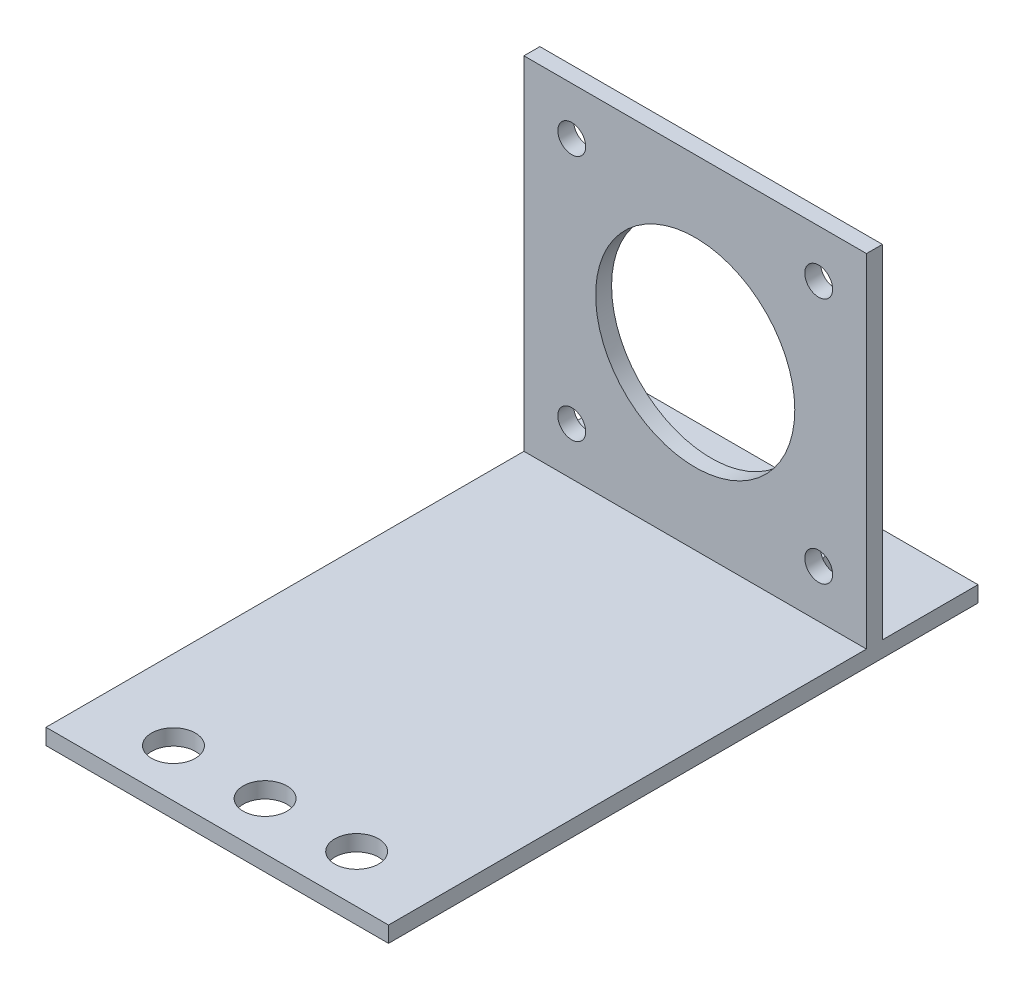
ISO-10303-21;
HEADER;
FILE_DESCRIPTION(('STEP AP214'),'2;1');
FILE_NAME('part.step','',(''),(''),'','','');
FILE_SCHEMA(('AUTOMOTIVE_DESIGN { 1 0 10303 214 1 1 1 1 }'));
ENDSEC;
DATA;
#1=APPLICATION_CONTEXT('core data for automotive mechanical design processes');
#2=APPLICATION_PROTOCOL_DEFINITION('international standard','automotive_design',2000,#1);
#3=PRODUCT_CONTEXT('',#1,'mechanical');
#4=PRODUCT('Part','Part','',(#3));
#5=PRODUCT_RELATED_PRODUCT_CATEGORY('part','',(#4));
#6=PRODUCT_DEFINITION_FORMATION('','',#4);
#7=PRODUCT_DEFINITION_CONTEXT('part definition',#1,'design');
#8=PRODUCT_DEFINITION('design','',#6,#7);
#9=PRODUCT_DEFINITION_SHAPE('','',#8);
#10=(LENGTH_UNIT() NAMED_UNIT(*) SI_UNIT(.MILLI.,.METRE.));
#11=(NAMED_UNIT(*) PLANE_ANGLE_UNIT() SI_UNIT($,.RADIAN.));
#12=(NAMED_UNIT(*) SI_UNIT($,.STERADIAN.) SOLID_ANGLE_UNIT());
#13=UNCERTAINTY_MEASURE_WITH_UNIT(LENGTH_MEASURE(1.E-05),#10,'distance_accuracy_value','');
#14=(GEOMETRIC_REPRESENTATION_CONTEXT(3) GLOBAL_UNCERTAINTY_ASSIGNED_CONTEXT((#13)) GLOBAL_UNIT_ASSIGNED_CONTEXT((#10,
#11,#12)) REPRESENTATION_CONTEXT('',''));
#15=CARTESIAN_POINT('',(0.,0.,0.));
#16=DIRECTION('',(0.,0.,1.));
#17=DIRECTION('',(1.,0.,0.));
#18=AXIS2_PLACEMENT_3D('',#15,#16,#17);
#19=CARTESIAN_POINT('',(-21.5,43.,0.));
#20=DIRECTION('',(-1.,0.,0.));
#21=DIRECTION('',(0.,0.,1.));
#22=AXIS2_PLACEMENT_3D('',#19,#20,#21);
#23=PLANE('',#22);
#24=DIRECTION('',(0.,-1.,0.));
#25=VECTOR('',#24,1.);
#26=CARTESIAN_POINT('',(-21.5,43.,-25.));
#27=LINE('',#26,#25);
#28=CARTESIAN_POINT('',(-21.5,43.,-25.));
#29=VERTEX_POINT('',#28);
#30=CARTESIAN_POINT('',(-21.5,0.,-25.));
#31=VERTEX_POINT('',#30);
#32=EDGE_CURVE('E52',#29,#31,#27,.T.);
#33=ORIENTED_EDGE('',*,*,#32,.T.);
#34=DIRECTION('',(0.,0.,-1.));
#35=VECTOR('',#34,1.);
#36=CARTESIAN_POINT('',(-21.5,0.,37.));
#37=LINE('',#36,#35);
#38=CARTESIAN_POINT('',(-21.5,0.,-37.));
#39=VERTEX_POINT('',#38);
#40=EDGE_CURVE('E127',#31,#39,#37,.T.);
#41=ORIENTED_EDGE('',*,*,#40,.T.);
#42=DIRECTION('',(0.,1.,0.));
#43=VECTOR('',#42,1.);
#44=CARTESIAN_POINT('',(-21.5,-2.,-37.));
#45=LINE('',#44,#43);
#46=CARTESIAN_POINT('',(-21.5,-2.,-37.));
#47=VERTEX_POINT('',#46);
#48=EDGE_CURVE('E145',#47,#39,#45,.T.);
#49=ORIENTED_EDGE('',*,*,#48,.F.);
#50=DIRECTION('',(0.,0.,-1.));
#51=VECTOR('',#50,1.);
#52=CARTESIAN_POINT('',(-21.5,-2.,37.));
#53=LINE('',#52,#51);
#54=CARTESIAN_POINT('',(-21.5,-2.,37.));
#55=VERTEX_POINT('',#54);
#56=EDGE_CURVE('E111',#55,#47,#53,.T.);
#57=ORIENTED_EDGE('',*,*,#56,.F.);
#58=DIRECTION('',(0.,1.,0.));
#59=VECTOR('',#58,1.);
#60=CARTESIAN_POINT('',(-21.5,-2.,37.));
#61=LINE('',#60,#59);
#62=CARTESIAN_POINT('',(-21.5,0.,37.));
#63=VERTEX_POINT('',#62);
#64=EDGE_CURVE('E122',#55,#63,#61,.T.);
#65=ORIENTED_EDGE('',*,*,#64,.T.);
#66=CARTESIAN_POINT('',(-21.5,0.,-23.));
#67=VERTEX_POINT('',#66);
#68=EDGE_CURVE('E124',#63,#67,#37,.T.);
#69=ORIENTED_EDGE('',*,*,#68,.T.);
#70=DIRECTION('',(0.,-1.,0.));
#71=VECTOR('',#70,1.);
#72=CARTESIAN_POINT('',(-21.5,43.,-23.));
#73=LINE('',#72,#71);
#74=CARTESIAN_POINT('',(-21.5,43.,-23.));
#75=VERTEX_POINT('',#74);
#76=EDGE_CURVE('E11',#75,#67,#73,.T.);
#77=ORIENTED_EDGE('',*,*,#76,.F.);
#78=DIRECTION('',(0.,0.,-1.));
#79=VECTOR('',#78,1.);
#80=CARTESIAN_POINT('',(-21.5,43.,0.));
#81=LINE('',#80,#79);
#82=EDGE_CURVE('E149',#75,#29,#81,.T.);
#83=ORIENTED_EDGE('',*,*,#82,.T.);
#84=EDGE_LOOP('',(#33,#41,#49,#57,#65,#69,#77,#83));
#85=FACE_BOUND('',#84,.T.);
#86=ADVANCED_FACE('F37',(#85),#23,.T.);
#87=CARTESIAN_POINT('',(0.,43.,-23.));
#88=DIRECTION('',(0.,0.,-1.));
#89=DIRECTION('',(-1.,0.,0.));
#90=AXIS2_PLACEMENT_3D('',#87,#88,#89);
#91=PLANE('',#90);
#92=CARTESIAN_POINT('',(15.5000000000001,37.0000000000004,-23.));
#93=DIRECTION('',(0.,0.,1.));
#94=DIRECTION('',(1.,0.,0.));
#95=AXIS2_PLACEMENT_3D('',#92,#93,#94);
#96=CIRCLE('',#95,1.75);
#97=CARTESIAN_POINT('',(17.2500000000001,37.0000000000004,-23.));
#98=VERTEX_POINT('',#97);
#99=EDGE_CURVE('E209',#98,#98,#96,.T.);
#100=ORIENTED_EDGE('',*,*,#99,.F.);
#101=EDGE_LOOP('',(#100));
#102=FACE_BOUND('',#101,.T.);
#103=CARTESIAN_POINT('',(-15.4999999999997,6.00000000000016,-23.));
#104=DIRECTION('',(0.,0.,1.));
#105=DIRECTION('',(1.,0.,0.));
#106=AXIS2_PLACEMENT_3D('',#103,#104,#105);
#107=CIRCLE('',#106,1.75);
#108=CARTESIAN_POINT('',(-13.7499999999997,6.00000000000016,-23.));
#109=VERTEX_POINT('',#108);
#110=EDGE_CURVE('E213',#109,#109,#107,.T.);
#111=ORIENTED_EDGE('',*,*,#110,.F.);
#112=EDGE_LOOP('',(#111));
#113=FACE_BOUND('',#112,.T.);
#114=CARTESIAN_POINT('',(15.5000000000003,6.00000000000032,-23.));
#115=DIRECTION('',(0.,0.,1.));
#116=DIRECTION('',(1.,0.,0.));
#117=AXIS2_PLACEMENT_3D('',#114,#115,#116);
#118=CIRCLE('',#117,1.75);
#119=CARTESIAN_POINT('',(17.2500000000003,6.00000000000032,-23.));
#120=VERTEX_POINT('',#119);
#121=EDGE_CURVE('E217',#120,#120,#118,.T.);
#122=ORIENTED_EDGE('',*,*,#121,.F.);
#123=EDGE_LOOP('',(#122));
#124=FACE_BOUND('',#123,.T.);
#125=CARTESIAN_POINT('',(-15.5,37.,-23.));
#126=DIRECTION('',(0.,0.,1.));
#127=DIRECTION('',(1.,0.,0.));
#128=AXIS2_PLACEMENT_3D('',#125,#126,#127);
#129=CIRCLE('',#128,1.75);
#130=CARTESIAN_POINT('',(-13.75,37.,-23.));
#131=VERTEX_POINT('',#130);
#132=EDGE_CURVE('E221',#131,#131,#129,.T.);
#133=ORIENTED_EDGE('',*,*,#132,.F.);
#134=EDGE_LOOP('',(#133));
#135=FACE_BOUND('',#134,.T.);
#136=CARTESIAN_POINT('',(0.,21.5,-23.));
#137=DIRECTION('',(0.,0.,1.));
#138=DIRECTION('',(1.,0.,0.));
#139=AXIS2_PLACEMENT_3D('',#136,#137,#138);
#140=CIRCLE('',#139,12.5);
#141=CARTESIAN_POINT('',(12.5,21.5,-23.));
#142=VERTEX_POINT('',#141);
#143=EDGE_CURVE('E138',#142,#142,#140,.T.);
#144=ORIENTED_EDGE('',*,*,#143,.F.);
#145=EDGE_LOOP('',(#144));
#146=FACE_BOUND('',#145,.T.);
#147=DIRECTION('',(1.,0.,0.));
#148=VECTOR('',#147,1.);
#149=CARTESIAN_POINT('',(0.,0.,-23.));
#150=LINE('',#149,#148);
#151=CARTESIAN_POINT('',(21.5,0.,-23.));
#152=VERTEX_POINT('',#151);
#153=EDGE_CURVE('E144',#67,#152,#150,.T.);
#154=ORIENTED_EDGE('',*,*,#153,.T.);
#155=DIRECTION('',(0.,-1.,0.));
#156=VECTOR('',#155,1.);
#157=CARTESIAN_POINT('',(21.5,43.,-23.));
#158=LINE('',#157,#156);
#159=CARTESIAN_POINT('',(21.5,43.,-23.));
#160=VERTEX_POINT('',#159);
#161=EDGE_CURVE('E45',#160,#152,#158,.T.);
#162=ORIENTED_EDGE('',*,*,#161,.F.);
#163=DIRECTION('',(1.,0.,0.));
#164=VECTOR('',#163,1.);
#165=CARTESIAN_POINT('',(0.,43.,-23.));
#166=LINE('',#165,#164);
#167=EDGE_CURVE('E151',#75,#160,#166,.T.);
#168=ORIENTED_EDGE('',*,*,#167,.F.);
#169=ORIENTED_EDGE('',*,*,#76,.T.);
#170=EDGE_LOOP('',(#154,#162,#168,#169));
#171=FACE_BOUND('',#170,.T.);
#172=ADVANCED_FACE('F169',(#102,#113,#124,#135,#146,#171),#91,.F.);
#173=CARTESIAN_POINT('',(21.5,43.,0.));
#174=DIRECTION('',(-1.,0.,0.));
#175=DIRECTION('',(0.,0.,1.));
#176=AXIS2_PLACEMENT_3D('',#173,#174,#175);
#177=PLANE('',#176);
#178=ORIENTED_EDGE('',*,*,#161,.T.);
#179=DIRECTION('',(0.,0.,-1.));
#180=VECTOR('',#179,1.);
#181=CARTESIAN_POINT('',(21.5,0.,37.));
#182=LINE('',#181,#180);
#183=CARTESIAN_POINT('',(21.5,0.,37.));
#184=VERTEX_POINT('',#183);
#185=EDGE_CURVE('E105',#184,#152,#182,.T.);
#186=ORIENTED_EDGE('',*,*,#185,.F.);
#187=DIRECTION('',(0.,1.,0.));
#188=VECTOR('',#187,1.);
#189=CARTESIAN_POINT('',(21.5,-2.,37.));
#190=LINE('',#189,#188);
#191=CARTESIAN_POINT('',(21.5,-2.,37.));
#192=VERTEX_POINT('',#191);
#193=EDGE_CURVE('E98',#192,#184,#190,.T.);
#194=ORIENTED_EDGE('',*,*,#193,.F.);
#195=DIRECTION('',(0.,0.,-1.));
#196=VECTOR('',#195,1.);
#197=CARTESIAN_POINT('',(21.5,-2.,37.));
#198=LINE('',#197,#196);
#199=CARTESIAN_POINT('',(21.5,-2.,-37.));
#200=VERTEX_POINT('',#199);
#201=EDGE_CURVE('E103',#192,#200,#198,.T.);
#202=ORIENTED_EDGE('',*,*,#201,.T.);
#203=DIRECTION('',(0.,1.,0.));
#204=VECTOR('',#203,1.);
#205=CARTESIAN_POINT('',(21.5,-2.,-37.));
#206=LINE('',#205,#204);
#207=CARTESIAN_POINT('',(21.5,0.,-37.));
#208=VERTEX_POINT('',#207);
#209=EDGE_CURVE('E110',#200,#208,#206,.T.);
#210=ORIENTED_EDGE('',*,*,#209,.T.);
#211=CARTESIAN_POINT('',(21.5,0.,-25.));
#212=VERTEX_POINT('',#211);
#213=EDGE_CURVE('E137',#212,#208,#182,.T.);
#214=ORIENTED_EDGE('',*,*,#213,.F.);
#215=DIRECTION('',(0.,-1.,0.));
#216=VECTOR('',#215,1.);
#217=CARTESIAN_POINT('',(21.5,43.,-25.));
#218=LINE('',#217,#216);
#219=CARTESIAN_POINT('',(21.5,43.,-25.));
#220=VERTEX_POINT('',#219);
#221=EDGE_CURVE('E162',#220,#212,#218,.T.);
#222=ORIENTED_EDGE('',*,*,#221,.F.);
#223=DIRECTION('',(0.,0.,-1.));
#224=VECTOR('',#223,1.);
#225=CARTESIAN_POINT('',(21.5,43.,0.));
#226=LINE('',#225,#224);
#227=EDGE_CURVE('E154',#160,#220,#226,.T.);
#228=ORIENTED_EDGE('',*,*,#227,.F.);
#229=EDGE_LOOP('',(#178,#186,#194,#202,#210,#214,#222,#228));
#230=FACE_BOUND('',#229,.T.);
#231=ADVANCED_FACE('F101',(#230),#177,.F.);
#232=CARTESIAN_POINT('',(0.,43.,-25.));
#233=DIRECTION('',(0.,0.,-1.));
#234=DIRECTION('',(-1.,0.,0.));
#235=AXIS2_PLACEMENT_3D('',#232,#233,#234);
#236=PLANE('',#235);
#237=CARTESIAN_POINT('',(15.5000000000001,37.0000000000004,-25.));
#238=DIRECTION('',(0.,0.,-1.));
#239=DIRECTION('',(-1.,0.,0.));
#240=AXIS2_PLACEMENT_3D('',#237,#238,#239);
#241=CIRCLE('',#240,1.75);
#242=CARTESIAN_POINT('',(13.7500000000001,37.0000000000004,-25.));
#243=VERTEX_POINT('',#242);
#244=EDGE_CURVE('E237',#243,#243,#241,.F.);
#245=ORIENTED_EDGE('',*,*,#244,.T.);
#246=EDGE_LOOP('',(#245));
#247=FACE_BOUND('',#246,.T.);
#248=CARTESIAN_POINT('',(-15.4999999999997,6.00000000000016,-25.));
#249=DIRECTION('',(0.,0.,-1.));
#250=DIRECTION('',(-1.,0.,0.));
#251=AXIS2_PLACEMENT_3D('',#248,#249,#250);
#252=CIRCLE('',#251,1.75);
#253=CARTESIAN_POINT('',(-17.2499999999997,6.00000000000016,-25.));
#254=VERTEX_POINT('',#253);
#255=EDGE_CURVE('E230',#254,#254,#252,.F.);
#256=ORIENTED_EDGE('',*,*,#255,.T.);
#257=EDGE_LOOP('',(#256));
#258=FACE_BOUND('',#257,.T.);
#259=CARTESIAN_POINT('',(15.5000000000003,6.00000000000032,-25.));
#260=DIRECTION('',(0.,0.,-1.));
#261=DIRECTION('',(-1.,0.,0.));
#262=AXIS2_PLACEMENT_3D('',#259,#260,#261);
#263=CIRCLE('',#262,1.75);
#264=CARTESIAN_POINT('',(13.7500000000003,6.00000000000032,-25.));
#265=VERTEX_POINT('',#264);
#266=EDGE_CURVE('E229',#265,#265,#263,.F.);
#267=ORIENTED_EDGE('',*,*,#266,.T.);
#268=EDGE_LOOP('',(#267));
#269=FACE_BOUND('',#268,.T.);
#270=CARTESIAN_POINT('',(-15.5,37.,-25.));
#271=DIRECTION('',(0.,0.,-1.));
#272=DIRECTION('',(-1.,0.,0.));
#273=AXIS2_PLACEMENT_3D('',#270,#271,#272);
#274=CIRCLE('',#273,1.75);
#275=CARTESIAN_POINT('',(-17.25,37.,-25.));
#276=VERTEX_POINT('',#275);
#277=EDGE_CURVE('E226',#276,#276,#274,.F.);
#278=ORIENTED_EDGE('',*,*,#277,.T.);
#279=EDGE_LOOP('',(#278));
#280=FACE_BOUND('',#279,.T.);
#281=CARTESIAN_POINT('',(0.,21.5,-25.));
#282=DIRECTION('',(0.,0.,-1.));
#283=DIRECTION('',(-1.,0.,0.));
#284=AXIS2_PLACEMENT_3D('',#281,#282,#283);
#285=CIRCLE('',#284,12.5);
#286=CARTESIAN_POINT('',(-12.5,21.5,-25.));
#287=VERTEX_POINT('',#286);
#288=EDGE_CURVE('E130',#287,#287,#285,.F.);
#289=ORIENTED_EDGE('',*,*,#288,.T.);
#290=EDGE_LOOP('',(#289));
#291=FACE_BOUND('',#290,.T.);
#292=DIRECTION('',(1.,0.,0.));
#293=VECTOR('',#292,1.);
#294=CARTESIAN_POINT('',(0.,0.,-25.));
#295=LINE('',#294,#293);
#296=EDGE_CURVE('E152',#31,#212,#295,.T.);
#297=ORIENTED_EDGE('',*,*,#296,.F.);
#298=ORIENTED_EDGE('',*,*,#32,.F.);
#299=DIRECTION('',(1.,0.,0.));
#300=VECTOR('',#299,1.);
#301=CARTESIAN_POINT('',(0.,43.,-25.));
#302=LINE('',#301,#300);
#303=EDGE_CURVE('E156',#29,#220,#302,.T.);
#304=ORIENTED_EDGE('',*,*,#303,.T.);
#305=ORIENTED_EDGE('',*,*,#221,.T.);
#306=EDGE_LOOP('',(#297,#298,#304,#305));
#307=FACE_BOUND('',#306,.T.);
#308=ADVANCED_FACE('F181',(#247,#258,#269,#280,#291,#307),#236,.T.);
#309=CARTESIAN_POINT('',(0.,43.,0.));
#310=DIRECTION('',(0.,1.,0.));
#311=DIRECTION('',(0.,0.,1.));
#312=AXIS2_PLACEMENT_3D('',#309,#310,#311);
#313=PLANE('',#312);
#314=ORIENTED_EDGE('',*,*,#82,.F.);
#315=ORIENTED_EDGE('',*,*,#167,.T.);
#316=ORIENTED_EDGE('',*,*,#227,.T.);
#317=ORIENTED_EDGE('',*,*,#303,.F.);
#318=EDGE_LOOP('',(#314,#315,#316,#317));
#319=FACE_BOUND('',#318,.T.);
#320=ADVANCED_FACE('F184',(#319),#313,.T.);
#321=CARTESIAN_POINT('',(0.,0.,0.));
#322=DIRECTION('',(0.,1.,0.));
#323=DIRECTION('',(0.,0.,1.));
#324=AXIS2_PLACEMENT_3D('',#321,#322,#323);
#325=PLANE('',#324);
#326=CARTESIAN_POINT('',(-11.5,0.,31.));
#327=DIRECTION('',(0.,1.,0.));
#328=DIRECTION('',(0.,0.,1.));
#329=AXIS2_PLACEMENT_3D('',#326,#327,#328);
#330=CIRCLE('',#329,2.75);
#331=CARTESIAN_POINT('',(-11.5,0.,33.75));
#332=VERTEX_POINT('',#331);
#333=EDGE_CURVE('E272',#332,#332,#330,.T.);
#334=ORIENTED_EDGE('',*,*,#333,.F.);
#335=EDGE_LOOP('',(#334));
#336=FACE_BOUND('',#335,.T.);
#337=CARTESIAN_POINT('',(11.5,0.,31.));
#338=DIRECTION('',(0.,1.,0.));
#339=DIRECTION('',(0.,0.,1.));
#340=AXIS2_PLACEMENT_3D('',#337,#338,#339);
#341=CIRCLE('',#340,2.75);
#342=CARTESIAN_POINT('',(11.5,0.,33.75));
#343=VERTEX_POINT('',#342);
#344=EDGE_CURVE('E266',#343,#343,#341,.T.);
#345=ORIENTED_EDGE('',*,*,#344,.F.);
#346=EDGE_LOOP('',(#345));
#347=FACE_BOUND('',#346,.T.);
#348=CARTESIAN_POINT('',(0.,0.,31.));
#349=DIRECTION('',(0.,1.,0.));
#350=DIRECTION('',(0.,0.,1.));
#351=AXIS2_PLACEMENT_3D('',#348,#349,#350);
#352=CIRCLE('',#351,2.75);
#353=CARTESIAN_POINT('',(0.,0.,33.75));
#354=VERTEX_POINT('',#353);
#355=EDGE_CURVE('E252',#354,#354,#352,.T.);
#356=ORIENTED_EDGE('',*,*,#355,.F.);
#357=EDGE_LOOP('',(#356));
#358=FACE_BOUND('',#357,.T.);
#359=ORIENTED_EDGE('',*,*,#153,.F.);
#360=ORIENTED_EDGE('',*,*,#68,.F.);
#361=DIRECTION('',(1.,0.,0.));
#362=VECTOR('',#361,1.);
#363=CARTESIAN_POINT('',(-21.5,0.,37.));
#364=LINE('',#363,#362);
#365=EDGE_CURVE('E135',#63,#184,#364,.T.);
#366=ORIENTED_EDGE('',*,*,#365,.T.);
#367=ORIENTED_EDGE('',*,*,#185,.T.);
#368=EDGE_LOOP('',(#359,#360,#366,#367));
#369=FACE_BOUND('',#368,.T.);
#370=ADVANCED_FACE('F173',(#336,#347,#358,#369),#325,.T.);
#371=CARTESIAN_POINT('',(-21.5,-2.,37.));
#372=DIRECTION('',(0.,0.,1.));
#373=DIRECTION('',(1.,0.,0.));
#374=AXIS2_PLACEMENT_3D('',#371,#372,#373);
#375=PLANE('',#374);
#376=ORIENTED_EDGE('',*,*,#365,.F.);
#377=ORIENTED_EDGE('',*,*,#64,.F.);
#378=DIRECTION('',(1.,0.,0.));
#379=VECTOR('',#378,1.);
#380=CARTESIAN_POINT('',(-21.5,-2.,37.));
#381=LINE('',#380,#379);
#382=EDGE_CURVE('E116',#55,#192,#381,.T.);
#383=ORIENTED_EDGE('',*,*,#382,.T.);
#384=ORIENTED_EDGE('',*,*,#193,.T.);
#385=EDGE_LOOP('',(#376,#377,#383,#384));
#386=FACE_BOUND('',#385,.T.);
#387=ADVANCED_FACE('F121',(#386),#375,.T.);
#388=CARTESIAN_POINT('',(-21.5,-2.,-37.));
#389=DIRECTION('',(0.,0.,1.));
#390=DIRECTION('',(1.,0.,0.));
#391=AXIS2_PLACEMENT_3D('',#388,#389,#390);
#392=PLANE('',#391);
#393=DIRECTION('',(1.,0.,0.));
#394=VECTOR('',#393,1.);
#395=CARTESIAN_POINT('',(-21.5,0.,-37.));
#396=LINE('',#395,#394);
#397=EDGE_CURVE('E140',#39,#208,#396,.T.);
#398=ORIENTED_EDGE('',*,*,#397,.T.);
#399=ORIENTED_EDGE('',*,*,#209,.F.);
#400=DIRECTION('',(1.,0.,0.));
#401=VECTOR('',#400,1.);
#402=CARTESIAN_POINT('',(-21.5,-2.,-37.));
#403=LINE('',#402,#401);
#404=EDGE_CURVE('E118',#47,#200,#403,.T.);
#405=ORIENTED_EDGE('',*,*,#404,.F.);
#406=ORIENTED_EDGE('',*,*,#48,.T.);
#407=EDGE_LOOP('',(#398,#399,#405,#406));
#408=FACE_BOUND('',#407,.T.);
#409=ADVANCED_FACE('F178',(#408),#392,.F.);
#410=CARTESIAN_POINT('',(0.,-2.,0.));
#411=DIRECTION('',(0.,1.,0.));
#412=DIRECTION('',(0.,0.,1.));
#413=AXIS2_PLACEMENT_3D('',#410,#411,#412);
#414=PLANE('',#413);
#415=CARTESIAN_POINT('',(-11.5,-2.,31.));
#416=DIRECTION('',(0.,1.,0.));
#417=DIRECTION('',(0.,0.,1.));
#418=AXIS2_PLACEMENT_3D('',#415,#416,#417);
#419=CIRCLE('',#418,2.75);
#420=CARTESIAN_POINT('',(-11.5,-2.,33.75));
#421=VERTEX_POINT('',#420);
#422=EDGE_CURVE('E261',#421,#421,#419,.F.);
#423=ORIENTED_EDGE('',*,*,#422,.F.);
#424=EDGE_LOOP('',(#423));
#425=FACE_BOUND('',#424,.T.);
#426=CARTESIAN_POINT('',(11.5,-2.,-31.));
#427=DIRECTION('',(0.,1.,0.));
#428=DIRECTION('',(0.,0.,1.));
#429=AXIS2_PLACEMENT_3D('',#426,#427,#428);
#430=CIRCLE('',#429,2.75);
#431=CARTESIAN_POINT('',(11.5,-2.,-28.25));
#432=VERTEX_POINT('',#431);
#433=EDGE_CURVE('E269',#432,#432,#430,.F.);
#434=ORIENTED_EDGE('',*,*,#433,.F.);
#435=EDGE_LOOP('',(#434));
#436=FACE_BOUND('',#435,.T.);
#437=CARTESIAN_POINT('',(11.5,-2.,31.));
#438=DIRECTION('',(0.,1.,0.));
#439=DIRECTION('',(0.,0.,1.));
#440=AXIS2_PLACEMENT_3D('',#437,#438,#439);
#441=CIRCLE('',#440,2.75);
#442=CARTESIAN_POINT('',(11.5,-2.,33.75));
#443=VERTEX_POINT('',#442);
#444=EDGE_CURVE('E262',#443,#443,#441,.F.);
#445=ORIENTED_EDGE('',*,*,#444,.F.);
#446=EDGE_LOOP('',(#445));
#447=FACE_BOUND('',#446,.T.);
#448=CARTESIAN_POINT('',(-11.5,-2.,-31.));
#449=DIRECTION('',(0.,1.,0.));
#450=DIRECTION('',(0.,0.,1.));
#451=AXIS2_PLACEMENT_3D('',#448,#449,#450);
#452=CIRCLE('',#451,2.75);
#453=CARTESIAN_POINT('',(-11.5,-2.,-28.25));
#454=VERTEX_POINT('',#453);
#455=EDGE_CURVE('E255',#454,#454,#452,.F.);
#456=ORIENTED_EDGE('',*,*,#455,.F.);
#457=EDGE_LOOP('',(#456));
#458=FACE_BOUND('',#457,.T.);
#459=CARTESIAN_POINT('',(0.,-2.,31.));
#460=DIRECTION('',(0.,1.,0.));
#461=DIRECTION('',(0.,0.,1.));
#462=AXIS2_PLACEMENT_3D('',#459,#460,#461);
#463=CIRCLE('',#462,2.75);
#464=CARTESIAN_POINT('',(0.,-2.,33.75));
#465=VERTEX_POINT('',#464);
#466=EDGE_CURVE('E249',#465,#465,#463,.F.);
#467=ORIENTED_EDGE('',*,*,#466,.F.);
#468=EDGE_LOOP('',(#467));
#469=FACE_BOUND('',#468,.T.);
#470=CARTESIAN_POINT('',(0.,-2.,-31.));
#471=DIRECTION('',(0.,1.,0.));
#472=DIRECTION('',(0.,0.,1.));
#473=AXIS2_PLACEMENT_3D('',#470,#471,#472);
#474=CIRCLE('',#473,2.75);
#475=CARTESIAN_POINT('',(0.,-2.,-28.25));
#476=VERTEX_POINT('',#475);
#477=EDGE_CURVE('E238',#476,#476,#474,.F.);
#478=ORIENTED_EDGE('',*,*,#477,.F.);
#479=EDGE_LOOP('',(#478));
#480=FACE_BOUND('',#479,.T.);
#481=ORIENTED_EDGE('',*,*,#382,.F.);
#482=ORIENTED_EDGE('',*,*,#56,.T.);
#483=ORIENTED_EDGE('',*,*,#404,.T.);
#484=ORIENTED_EDGE('',*,*,#201,.F.);
#485=EDGE_LOOP('',(#481,#482,#483,#484));
#486=FACE_BOUND('',#485,.T.);
#487=ADVANCED_FACE('F115',(#425,#436,#447,#458,#469,#480,#486),#414,.F.);
#488=CARTESIAN_POINT('',(11.5,0.,-31.));
#489=DIRECTION('',(0.,1.,0.));
#490=DIRECTION('',(0.,0.,1.));
#491=AXIS2_PLACEMENT_3D('',#488,#489,#490);
#492=CIRCLE('',#491,2.75);
#493=CARTESIAN_POINT('',(11.5,0.,-28.25));
#494=VERTEX_POINT('',#493);
#495=EDGE_CURVE('E265',#494,#494,#492,.T.);
#496=ORIENTED_EDGE('',*,*,#495,.F.);
#497=EDGE_LOOP('',(#496));
#498=FACE_BOUND('',#497,.T.);
#499=CARTESIAN_POINT('',(-11.5,0.,-31.));
#500=DIRECTION('',(0.,1.,0.));
#501=DIRECTION('',(0.,0.,1.));
#502=AXIS2_PLACEMENT_3D('',#499,#500,#501);
#503=CIRCLE('',#502,2.75);
#504=CARTESIAN_POINT('',(-11.5,0.,-28.25));
#505=VERTEX_POINT('',#504);
#506=EDGE_CURVE('E258',#505,#505,#503,.T.);
#507=ORIENTED_EDGE('',*,*,#506,.F.);
#508=EDGE_LOOP('',(#507));
#509=FACE_BOUND('',#508,.T.);
#510=CARTESIAN_POINT('',(0.,0.,-31.));
#511=DIRECTION('',(0.,1.,0.));
#512=DIRECTION('',(0.,0.,1.));
#513=AXIS2_PLACEMENT_3D('',#510,#511,#512);
#514=CIRCLE('',#513,2.75);
#515=CARTESIAN_POINT('',(0.,0.,-28.25));
#516=VERTEX_POINT('',#515);
#517=EDGE_CURVE('E246',#516,#516,#514,.T.);
#518=ORIENTED_EDGE('',*,*,#517,.F.);
#519=EDGE_LOOP('',(#518));
#520=FACE_BOUND('',#519,.T.);
#521=ORIENTED_EDGE('',*,*,#40,.F.);
#522=ORIENTED_EDGE('',*,*,#296,.T.);
#523=ORIENTED_EDGE('',*,*,#213,.T.);
#524=ORIENTED_EDGE('',*,*,#397,.F.);
#525=EDGE_LOOP('',(#521,#522,#523,#524));
#526=FACE_BOUND('',#525,.T.);
#527=ADVANCED_FACE('F193',(#498,#509,#520,#526),#325,.T.);
#528=CARTESIAN_POINT('',(0.,21.5,-37.001));
#529=DIRECTION('',(0.,0.,1.));
#530=DIRECTION('',(1.,0.,0.));
#531=AXIS2_PLACEMENT_3D('',#528,#529,#530);
#532=CYLINDRICAL_SURFACE('',#531,12.5);
#533=ORIENTED_EDGE('',*,*,#288,.F.);
#534=EDGE_LOOP('',(#533));
#535=FACE_BOUND('',#534,.T.);
#536=ORIENTED_EDGE('',*,*,#143,.T.);
#537=EDGE_LOOP('',(#536));
#538=FACE_BOUND('',#537,.T.);
#539=ADVANCED_FACE('F320',(#535,#538),#532,.F.);
#540=CARTESIAN_POINT('',(-15.5,37.,-37.001));
#541=DIRECTION('',(0.,0.,1.));
#542=DIRECTION('',(1.,0.,0.));
#543=AXIS2_PLACEMENT_3D('',#540,#541,#542);
#544=CYLINDRICAL_SURFACE('',#543,1.75);
#545=ORIENTED_EDGE('',*,*,#277,.F.);
#546=EDGE_LOOP('',(#545));
#547=FACE_BOUND('',#546,.T.);
#548=ORIENTED_EDGE('',*,*,#132,.T.);
#549=EDGE_LOOP('',(#548));
#550=FACE_BOUND('',#549,.T.);
#551=ADVANCED_FACE('F317',(#547,#550),#544,.F.);
#552=CARTESIAN_POINT('',(15.5000000000003,6.00000000000032,-37.001));
#553=DIRECTION('',(0.,0.,1.));
#554=DIRECTION('',(1.,0.,0.));
#555=AXIS2_PLACEMENT_3D('',#552,#553,#554);
#556=CYLINDRICAL_SURFACE('',#555,1.75);
#557=ORIENTED_EDGE('',*,*,#266,.F.);
#558=EDGE_LOOP('',(#557));
#559=FACE_BOUND('',#558,.T.);
#560=ORIENTED_EDGE('',*,*,#121,.T.);
#561=EDGE_LOOP('',(#560));
#562=FACE_BOUND('',#561,.T.);
#563=ADVANCED_FACE('F314',(#559,#562),#556,.F.);
#564=CARTESIAN_POINT('',(-15.4999999999997,6.00000000000016,-37.001));
#565=DIRECTION('',(0.,0.,1.));
#566=DIRECTION('',(1.,0.,0.));
#567=AXIS2_PLACEMENT_3D('',#564,#565,#566);
#568=CYLINDRICAL_SURFACE('',#567,1.75);
#569=ORIENTED_EDGE('',*,*,#255,.F.);
#570=EDGE_LOOP('',(#569));
#571=FACE_BOUND('',#570,.T.);
#572=ORIENTED_EDGE('',*,*,#110,.T.);
#573=EDGE_LOOP('',(#572));
#574=FACE_BOUND('',#573,.T.);
#575=ADVANCED_FACE('F308',(#571,#574),#568,.F.);
#576=CARTESIAN_POINT('',(15.5000000000001,37.0000000000004,-37.001));
#577=DIRECTION('',(0.,0.,1.));
#578=DIRECTION('',(1.,0.,0.));
#579=AXIS2_PLACEMENT_3D('',#576,#577,#578);
#580=CYLINDRICAL_SURFACE('',#579,1.75);
#581=ORIENTED_EDGE('',*,*,#244,.F.);
#582=EDGE_LOOP('',(#581));
#583=FACE_BOUND('',#582,.T.);
#584=ORIENTED_EDGE('',*,*,#99,.T.);
#585=EDGE_LOOP('',(#584));
#586=FACE_BOUND('',#585,.T.);
#587=ADVANCED_FACE('F302',(#583,#586),#580,.F.);
#588=CARTESIAN_POINT('',(0.,-2.001,-31.));
#589=DIRECTION('',(0.,1.,0.));
#590=DIRECTION('',(0.,0.,1.));
#591=AXIS2_PLACEMENT_3D('',#588,#589,#590);
#592=CYLINDRICAL_SURFACE('',#591,2.75);
#593=ORIENTED_EDGE('',*,*,#517,.T.);
#594=EDGE_LOOP('',(#593));
#595=FACE_BOUND('',#594,.T.);
#596=ORIENTED_EDGE('',*,*,#477,.T.);
#597=EDGE_LOOP('',(#596));
#598=FACE_BOUND('',#597,.T.);
#599=ADVANCED_FACE('F291',(#595,#598),#592,.F.);
#600=CARTESIAN_POINT('',(0.,-2.001,31.));
#601=DIRECTION('',(0.,1.,0.));
#602=DIRECTION('',(0.,0.,1.));
#603=AXIS2_PLACEMENT_3D('',#600,#601,#602);
#604=CYLINDRICAL_SURFACE('',#603,2.75);
#605=ORIENTED_EDGE('',*,*,#355,.T.);
#606=EDGE_LOOP('',(#605));
#607=FACE_BOUND('',#606,.T.);
#608=ORIENTED_EDGE('',*,*,#466,.T.);
#609=EDGE_LOOP('',(#608));
#610=FACE_BOUND('',#609,.T.);
#611=ADVANCED_FACE('F287',(#607,#610),#604,.F.);
#612=CARTESIAN_POINT('',(-11.5,-2.001,-31.));
#613=DIRECTION('',(0.,1.,0.));
#614=DIRECTION('',(0.,0.,1.));
#615=AXIS2_PLACEMENT_3D('',#612,#613,#614);
#616=CYLINDRICAL_SURFACE('',#615,2.75);
#617=ORIENTED_EDGE('',*,*,#506,.T.);
#618=EDGE_LOOP('',(#617));
#619=FACE_BOUND('',#618,.T.);
#620=ORIENTED_EDGE('',*,*,#455,.T.);
#621=EDGE_LOOP('',(#620));
#622=FACE_BOUND('',#621,.T.);
#623=ADVANCED_FACE('F290',(#619,#622),#616,.F.);
#624=CARTESIAN_POINT('',(11.5,-2.001,-31.));
#625=DIRECTION('',(0.,1.,0.));
#626=DIRECTION('',(0.,0.,1.));
#627=AXIS2_PLACEMENT_3D('',#624,#625,#626);
#628=CYLINDRICAL_SURFACE('',#627,2.75);
#629=ORIENTED_EDGE('',*,*,#495,.T.);
#630=EDGE_LOOP('',(#629));
#631=FACE_BOUND('',#630,.T.);
#632=ORIENTED_EDGE('',*,*,#433,.T.);
#633=EDGE_LOOP('',(#632));
#634=FACE_BOUND('',#633,.T.);
#635=ADVANCED_FACE('F437',(#631,#634),#628,.F.);
#636=CARTESIAN_POINT('',(11.5,-2.001,31.));
#637=DIRECTION('',(0.,1.,0.));
#638=DIRECTION('',(0.,0.,1.));
#639=AXIS2_PLACEMENT_3D('',#636,#637,#638);
#640=CYLINDRICAL_SURFACE('',#639,2.75);
#641=ORIENTED_EDGE('',*,*,#344,.T.);
#642=EDGE_LOOP('',(#641));
#643=FACE_BOUND('',#642,.T.);
#644=ORIENTED_EDGE('',*,*,#444,.T.);
#645=EDGE_LOOP('',(#644));
#646=FACE_BOUND('',#645,.T.);
#647=ADVANCED_FACE('F443',(#643,#646),#640,.F.);
#648=CARTESIAN_POINT('',(-11.5,-2.001,31.));
#649=DIRECTION('',(0.,1.,0.));
#650=DIRECTION('',(0.,0.,1.));
#651=AXIS2_PLACEMENT_3D('',#648,#649,#650);
#652=CYLINDRICAL_SURFACE('',#651,2.75);
#653=ORIENTED_EDGE('',*,*,#333,.T.);
#654=EDGE_LOOP('',(#653));
#655=FACE_BOUND('',#654,.T.);
#656=ORIENTED_EDGE('',*,*,#422,.T.);
#657=EDGE_LOOP('',(#656));
#658=FACE_BOUND('',#657,.T.);
#659=ADVANCED_FACE('F280',(#655,#658),#652,.F.);
#660=CLOSED_SHELL('',(#86,#172,#231,#308,#320,#370,#387,#409,#487,#527,#539,#551,#563,#575,#587,
#599,#611,#623,#635,#647,#659));
#661=MANIFOLD_SOLID_BREP('B2',#660);
#662=ADVANCED_BREP_SHAPE_REPRESENTATION('',(#18,#661),#14);
#663=SHAPE_DEFINITION_REPRESENTATION(#9,#662);
ENDSEC;
END-ISO-10303-21;
